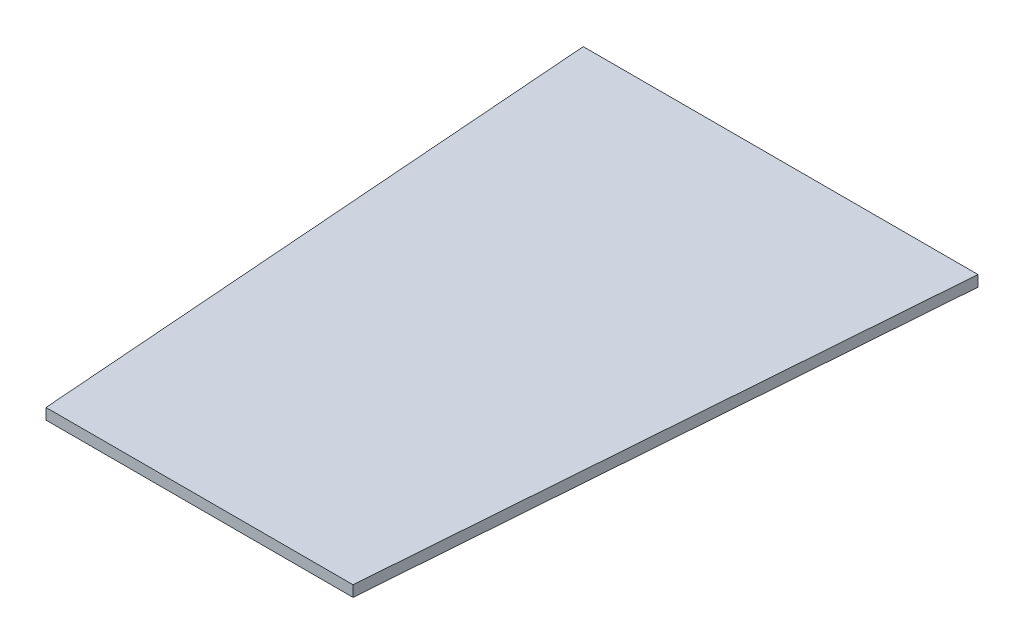
ISO-10303-21;
HEADER;
FILE_DESCRIPTION(('STEP AP214'),'2;1');
FILE_NAME('part.step','',(''),(''),'','','');
FILE_SCHEMA(('AUTOMOTIVE_DESIGN { 1 0 10303 214 1 1 1 1 }'));
ENDSEC;
DATA;
#1=APPLICATION_CONTEXT('core data for automotive mechanical design processes');
#2=APPLICATION_PROTOCOL_DEFINITION('international standard','automotive_design',2000,#1);
#3=PRODUCT_CONTEXT('',#1,'mechanical');
#4=PRODUCT('Part','Part','',(#3));
#5=PRODUCT_RELATED_PRODUCT_CATEGORY('part','',(#4));
#6=PRODUCT_DEFINITION_FORMATION('','',#4);
#7=PRODUCT_DEFINITION_CONTEXT('part definition',#1,'design');
#8=PRODUCT_DEFINITION('design','',#6,#7);
#9=PRODUCT_DEFINITION_SHAPE('','',#8);
#10=(LENGTH_UNIT() NAMED_UNIT(*) SI_UNIT(.MILLI.,.METRE.));
#11=(NAMED_UNIT(*) PLANE_ANGLE_UNIT() SI_UNIT($,.RADIAN.));
#12=(NAMED_UNIT(*) SI_UNIT($,.STERADIAN.) SOLID_ANGLE_UNIT());
#13=UNCERTAINTY_MEASURE_WITH_UNIT(LENGTH_MEASURE(1.E-05),#10,'distance_accuracy_value','');
#14=(GEOMETRIC_REPRESENTATION_CONTEXT(3) GLOBAL_UNCERTAINTY_ASSIGNED_CONTEXT((#13)) GLOBAL_UNIT_ASSIGNED_CONTEXT((#10,
#11,#12)) REPRESENTATION_CONTEXT('',''));
#15=CARTESIAN_POINT('',(0.,0.,0.));
#16=DIRECTION('',(0.,0.,1.));
#17=DIRECTION('',(1.,0.,0.));
#18=AXIS2_PLACEMENT_3D('',#15,#16,#17);
#19=CARTESIAN_POINT('',(-113.235093167702,31.75,-133.507763975155));
#20=DIRECTION('',(0.,0.,-1.));
#21=DIRECTION('',(-1.,0.,0.));
#22=AXIS2_PLACEMENT_3D('',#19,#20,#21);
#23=PLANE('',#22);
#24=DIRECTION('',(1.,0.,0.));
#25=VECTOR('',#24,1.);
#26=CARTESIAN_POINT('',(-113.235093167702,25.4,-133.507763975155));
#27=LINE('',#26,#25);
#28=CARTESIAN_POINT('',(-113.235093167702,25.4,-133.507763975155));
#29=VERTEX_POINT('',#28);
#30=CARTESIAN_POINT('',(115.364906832298,25.4,-133.507763975155));
#31=VERTEX_POINT('',#30);
#32=EDGE_CURVE('E102',#29,#31,#27,.T.);
#33=ORIENTED_EDGE('',*,*,#32,.F.);
#34=DIRECTION('',(0.,-1.,0.));
#35=VECTOR('',#34,1.);
#36=CARTESIAN_POINT('',(-113.235093167702,31.75,-133.507763975155));
#37=LINE('',#36,#35);
#38=CARTESIAN_POINT('',(-113.235093167702,31.75,-133.507763975155));
#39=VERTEX_POINT('',#38);
#40=EDGE_CURVE('E11',#39,#29,#37,.T.);
#41=ORIENTED_EDGE('',*,*,#40,.F.);
#42=DIRECTION('',(1.,0.,0.));
#43=VECTOR('',#42,1.);
#44=CARTESIAN_POINT('',(-113.235093167702,31.75,-133.507763975155));
#45=LINE('',#44,#43);
#46=CARTESIAN_POINT('',(115.364906832298,31.75,-133.507763975155));
#47=VERTEX_POINT('',#46);
#48=EDGE_CURVE('E97',#39,#47,#45,.T.);
#49=ORIENTED_EDGE('',*,*,#48,.T.);
#50=DIRECTION('',(0.,-1.,0.));
#51=VECTOR('',#50,1.);
#52=CARTESIAN_POINT('',(115.364906832298,31.75,-133.507763975155));
#53=LINE('',#52,#51);
#54=EDGE_CURVE('E40',#47,#31,#53,.T.);
#55=ORIENTED_EDGE('',*,*,#54,.T.);
#56=EDGE_LOOP('',(#33,#41,#49,#55));
#57=FACE_BOUND('',#56,.T.);
#58=ADVANCED_FACE('F37',(#57),#23,.T.);
#59=CARTESIAN_POINT('',(-113.235093167702,31.75,-133.507763975155));
#60=DIRECTION('',(0.997164120486613,0.,-0.075257669470688));
#61=DIRECTION('',(-0.075257669470688,0.,-0.997164120486613));
#62=AXIS2_PLACEMENT_3D('',#59,#60,#61);
#63=PLANE('',#62);
#64=DIRECTION('',(0.075257669470688,0.,0.997164120486613));
#65=VECTOR('',#64,1.);
#66=CARTESIAN_POINT('',(-113.235093167702,25.4,-133.507763975155));
#67=LINE('',#66,#65);
#68=CARTESIAN_POINT('',(-87.8350931677018,25.4,203.042236024845));
#69=VERTEX_POINT('',#68);
#70=EDGE_CURVE('E70',#29,#69,#67,.T.);
#71=ORIENTED_EDGE('',*,*,#70,.T.);
#72=DIRECTION('',(0.,-1.,0.));
#73=VECTOR('',#72,1.);
#74=CARTESIAN_POINT('',(-87.8350931677018,31.75,203.042236024845));
#75=LINE('',#74,#73);
#76=CARTESIAN_POINT('',(-87.8350931677018,31.75,203.042236024845));
#77=VERTEX_POINT('',#76);
#78=EDGE_CURVE('E46',#77,#69,#75,.T.);
#79=ORIENTED_EDGE('',*,*,#78,.F.);
#80=DIRECTION('',(0.075257669470688,0.,0.997164120486613));
#81=VECTOR('',#80,1.);
#82=CARTESIAN_POINT('',(-113.235093167702,31.75,-133.507763975155));
#83=LINE('',#82,#81);
#84=EDGE_CURVE('E87',#39,#77,#83,.T.);
#85=ORIENTED_EDGE('',*,*,#84,.F.);
#86=ORIENTED_EDGE('',*,*,#40,.T.);
#87=EDGE_LOOP('',(#71,#79,#85,#86));
#88=FACE_BOUND('',#87,.T.);
#89=ADVANCED_FACE('F112',(#88),#63,.F.);
#90=CARTESIAN_POINT('',(-87.8350931677018,31.75,203.042236024845));
#91=DIRECTION('',(0.,0.,-1.));
#92=DIRECTION('',(-1.,0.,0.));
#93=AXIS2_PLACEMENT_3D('',#90,#91,#92);
#94=PLANE('',#93);
#95=DIRECTION('',(1.,0.,0.));
#96=VECTOR('',#95,1.);
#97=CARTESIAN_POINT('',(-87.8350931677018,25.4,203.042236024845));
#98=LINE('',#97,#96);
#99=CARTESIAN_POINT('',(89.9649068322982,25.4,203.042236024845));
#100=VERTEX_POINT('',#99);
#101=EDGE_CURVE('E94',#69,#100,#98,.T.);
#102=ORIENTED_EDGE('',*,*,#101,.T.);
#103=DIRECTION('',(0.,-1.,0.));
#104=VECTOR('',#103,1.);
#105=CARTESIAN_POINT('',(89.9649068322982,31.75,203.042236024845));
#106=LINE('',#105,#104);
#107=CARTESIAN_POINT('',(89.9649068322982,31.75,203.042236024845));
#108=VERTEX_POINT('',#107);
#109=EDGE_CURVE('E91',#108,#100,#106,.T.);
#110=ORIENTED_EDGE('',*,*,#109,.F.);
#111=DIRECTION('',(1.,0.,0.));
#112=VECTOR('',#111,1.);
#113=CARTESIAN_POINT('',(-87.8350931677018,31.75,203.042236024845));
#114=LINE('',#113,#112);
#115=EDGE_CURVE('E82',#77,#108,#114,.T.);
#116=ORIENTED_EDGE('',*,*,#115,.F.);
#117=ORIENTED_EDGE('',*,*,#78,.T.);
#118=EDGE_LOOP('',(#102,#110,#116,#117));
#119=FACE_BOUND('',#118,.T.);
#120=ADVANCED_FACE('F92',(#119),#94,.F.);
#121=CARTESIAN_POINT('',(115.364906832298,31.75,-133.507763975155));
#122=DIRECTION('',(0.997164120486613,0.,0.0752576694706877));
#123=DIRECTION('',(0.0752576694706877,0.,-0.997164120486613));
#124=AXIS2_PLACEMENT_3D('',#121,#122,#123);
#125=PLANE('',#124);
#126=DIRECTION('',(-0.0752576694706877,0.,0.997164120486613));
#127=VECTOR('',#126,1.);
#128=CARTESIAN_POINT('',(115.364906832298,25.4,-133.507763975155));
#129=LINE('',#128,#127);
#130=EDGE_CURVE('E105',#31,#100,#129,.T.);
#131=ORIENTED_EDGE('',*,*,#130,.F.);
#132=ORIENTED_EDGE('',*,*,#54,.F.);
#133=DIRECTION('',(-0.0752576694706877,0.,0.997164120486613));
#134=VECTOR('',#133,1.);
#135=CARTESIAN_POINT('',(115.364906832298,31.75,-133.507763975155));
#136=LINE('',#135,#134);
#137=EDGE_CURVE('E86',#47,#108,#136,.T.);
#138=ORIENTED_EDGE('',*,*,#137,.T.);
#139=ORIENTED_EDGE('',*,*,#109,.T.);
#140=EDGE_LOOP('',(#131,#132,#138,#139));
#141=FACE_BOUND('',#140,.T.);
#142=ADVANCED_FACE('F96',(#141),#125,.T.);
#143=CARTESIAN_POINT('',(0.,31.75,0.));
#144=DIRECTION('',(0.,-1.,0.));
#145=DIRECTION('',(0.,0.,-1.));
#146=AXIS2_PLACEMENT_3D('',#143,#144,#145);
#147=PLANE('',#146);
#148=ORIENTED_EDGE('',*,*,#48,.F.);
#149=ORIENTED_EDGE('',*,*,#84,.T.);
#150=ORIENTED_EDGE('',*,*,#115,.T.);
#151=ORIENTED_EDGE('',*,*,#137,.F.);
#152=EDGE_LOOP('',(#148,#149,#150,#151));
#153=FACE_BOUND('',#152,.T.);
#154=ADVANCED_FACE('F85',(#153),#147,.F.);
#155=CARTESIAN_POINT('',(0.,25.4,0.));
#156=DIRECTION('',(0.,-1.,0.));
#157=DIRECTION('',(0.,0.,-1.));
#158=AXIS2_PLACEMENT_3D('',#155,#156,#157);
#159=PLANE('',#158);
#160=ORIENTED_EDGE('',*,*,#32,.T.);
#161=ORIENTED_EDGE('',*,*,#130,.T.);
#162=ORIENTED_EDGE('',*,*,#101,.F.);
#163=ORIENTED_EDGE('',*,*,#70,.F.);
#164=EDGE_LOOP('',(#160,#161,#162,#163));
#165=FACE_BOUND('',#164,.T.);
#166=ADVANCED_FACE('F110',(#165),#159,.T.);
#167=CLOSED_SHELL('',(#58,#89,#120,#142,#154,#166));
#168=MANIFOLD_SOLID_BREP('B2',#167);
#169=ADVANCED_BREP_SHAPE_REPRESENTATION('',(#18,#168),#14);
#170=SHAPE_DEFINITION_REPRESENTATION(#9,#169);
ENDSEC;
END-ISO-10303-21;
